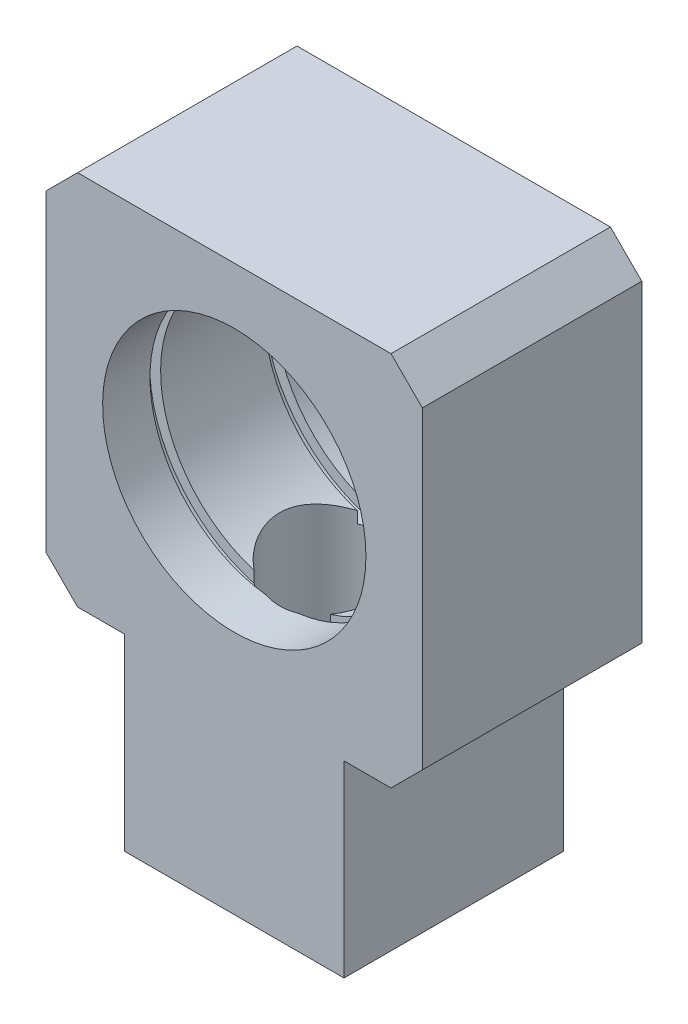
ISO-10303-21;
HEADER;
FILE_DESCRIPTION(('STEP AP214'),'2;1');
FILE_NAME('part.step','',(''),(''),'','','');
FILE_SCHEMA(('AUTOMOTIVE_DESIGN { 1 0 10303 214 1 1 1 1 }'));
ENDSEC;
DATA;
#1=APPLICATION_CONTEXT('core data for automotive mechanical design processes');
#2=APPLICATION_PROTOCOL_DEFINITION('international standard','automotive_design',2000,#1);
#3=PRODUCT_CONTEXT('',#1,'mechanical');
#4=PRODUCT('Part','Part','',(#3));
#5=PRODUCT_RELATED_PRODUCT_CATEGORY('part','',(#4));
#6=PRODUCT_DEFINITION_FORMATION('','',#4);
#7=PRODUCT_DEFINITION_CONTEXT('part definition',#1,'design');
#8=PRODUCT_DEFINITION('design','',#6,#7);
#9=PRODUCT_DEFINITION_SHAPE('','',#8);
#10=(LENGTH_UNIT() NAMED_UNIT(*) SI_UNIT(.MILLI.,.METRE.));
#11=(NAMED_UNIT(*) PLANE_ANGLE_UNIT() SI_UNIT($,.RADIAN.));
#12=(NAMED_UNIT(*) SI_UNIT($,.STERADIAN.) SOLID_ANGLE_UNIT());
#13=UNCERTAINTY_MEASURE_WITH_UNIT(LENGTH_MEASURE(1.E-05),#10,'distance_accuracy_value','');
#14=(GEOMETRIC_REPRESENTATION_CONTEXT(3) GLOBAL_UNCERTAINTY_ASSIGNED_CONTEXT((#13)) GLOBAL_UNIT_ASSIGNED_CONTEXT((#10,
#11,#12)) REPRESENTATION_CONTEXT('',''));
#15=CARTESIAN_POINT('',(0.,0.,0.));
#16=DIRECTION('',(0.,0.,1.));
#17=DIRECTION('',(1.,0.,0.));
#18=AXIS2_PLACEMENT_3D('',#15,#16,#17);
#19=CARTESIAN_POINT('',(0.,0.,17.5));
#20=DIRECTION('',(0.,0.,-1.));
#21=DIRECTION('',(-1.,0.,0.));
#22=AXIS2_PLACEMENT_3D('',#19,#20,#21);
#23=CYLINDRICAL_SURFACE('',#22,21.);
#24=CARTESIAN_POINT('',(0.,-21.,-10.25));
#25=CARTESIAN_POINT('',(-0.270318173228339,-20.9999987988339,-10.2499986530426));
#26=CARTESIAN_POINT('',(-0.540666583604552,-20.9947679895731,-10.2392938241465));
#27=CARTESIAN_POINT('',(-1.07938227490145,-20.9739756386897,-10.1965923011937));
#28=CARTESIAN_POINT('',(-1.34774857407788,-20.958409284867,-10.1645856890712));
#29=CARTESIAN_POINT('',(-1.88085275017994,-20.9173132009866,-10.0795772650897));
#30=CARTESIAN_POINT('',(-2.14558326039659,-20.8917656605435,-10.0265379199633));
#31=CARTESIAN_POINT('',(-2.6690000998639,-20.8313668568692,-9.90007210448331));
#32=CARTESIAN_POINT('',(-2.92768708081298,-20.7965166018708,-9.82664784342236));
#33=CARTESIAN_POINT('',(-3.43636275524586,-20.718527305079,-9.66049845106342));
#34=CARTESIAN_POINT('',(-3.68638105552626,-20.6754206314466,-9.56784857660264));
#35=CARTESIAN_POINT('',(-4.17727974846111,-20.5818555602817,-9.36394581168029));
#36=CARTESIAN_POINT('',(-4.41815992475495,-20.5313969888172,-9.25269248108714));
#37=CARTESIAN_POINT('',(-4.8893957620044,-20.4243035565994,-9.01255887621552));
#38=CARTESIAN_POINT('',(-5.11975556896248,-20.3676711592357,-8.88368562720002));
#39=CARTESIAN_POINT('',(-5.56902932842217,-20.2494419512969,-8.60916655401915));
#40=CARTESIAN_POINT('',(-5.78793872384252,-20.1878431886033,-8.46351412475551));
#41=CARTESIAN_POINT('',(-6.22564478947613,-20.0573301613556,-8.14744745193877));
#42=CARTESIAN_POINT('',(-6.44369230576423,-19.988198778282,-7.97608509697063));
#43=CARTESIAN_POINT('',(-6.86476638395887,-19.8475254815653,-7.61669936588422));
#44=CARTESIAN_POINT('',(-7.0677921326076,-19.7759834377172,-7.42867508892173));
#45=CARTESIAN_POINT('',(-7.45798743307269,-19.632159478354,-7.03686078245045));
#46=CARTESIAN_POINT('',(-7.64514754043553,-19.5598771504602,-6.83306149861386));
#47=CARTESIAN_POINT('',(-8.00258672800502,-19.4163773164506,-6.41074506401727));
#48=CARTESIAN_POINT('',(-8.17286270244347,-19.3451600082794,-6.19222521783807));
#49=CARTESIAN_POINT('',(-8.50740341516571,-19.2005127541019,-5.7249528852893));
#50=CARTESIAN_POINT('',(-8.67031219977446,-19.1273033856383,-5.4751584560692));
#51=CARTESIAN_POINT('',(-8.97428674749512,-18.9865802788274,-4.96122635907348));
#52=CARTESIAN_POINT('',(-9.11536174560266,-18.9190641379568,-4.6970948196436));
#53=CARTESIAN_POINT('',(-9.37444888408,-18.7920337373056,-4.15597825665459));
#54=CARTESIAN_POINT('',(-9.49246766193267,-18.7325171761298,-3.87899696081438));
#55=CARTESIAN_POINT('',(-9.70418846778782,-18.6237191631795,-3.31394356745148));
#56=CARTESIAN_POINT('',(-9.79789305986597,-18.5744366322752,-3.02587264307845));
#57=CARTESIAN_POINT('',(-9.95503040042,-18.4906688265308,-2.45795172283255));
#58=CARTESIAN_POINT('',(-10.0199129674849,-18.455486758189,-2.17860612070889));
#59=CARTESIAN_POINT('',(-10.1261675818067,-18.3974023892141,-1.6142079405387));
#60=CARTESIAN_POINT('',(-10.1675405905251,-18.3744995864026,-1.32915559637226));
#61=CARTESIAN_POINT('',(-10.2261333959265,-18.341955325854,-0.756044965616732));
#62=CARTESIAN_POINT('',(-10.2433719527444,-18.3323035679594,-0.4679891893262));
#63=CARTESIAN_POINT('',(-10.2534788099492,-18.3266531665458,0.108672038019253));
#64=CARTESIAN_POINT('',(-10.246349246455,-18.3306533262945,0.397277438677301));
#65=CARTESIAN_POINT('',(-10.2100238451678,-18.3509062756821,0.939828410630615));
#66=CARTESIAN_POINT('',(-10.1834119413873,-18.3657237692651,1.19400610480151));
#67=CARTESIAN_POINT('',(-10.1114308541839,-18.4054518433169,1.69897780562651));
#68=CARTESIAN_POINT('',(-10.0660554246242,-18.4303657847085,1.94977065677474));
#69=CARTESIAN_POINT('',(-9.95706959593977,-18.4894725737469,2.44618935320285));
#70=CARTESIAN_POINT('',(-9.89346203486704,-18.5236639772004,2.69181599628304));
#71=CARTESIAN_POINT('',(-9.7486302123183,-18.6002934109704,3.17659197933312));
#72=CARTESIAN_POINT('',(-9.66739894048307,-18.642734722234,3.41573869901372));
#73=CARTESIAN_POINT('',(-9.48600984541781,-18.735694041315,3.89158400588454));
#74=CARTESIAN_POINT('',(-9.38546219549037,-18.7863743483669,4.12810199356521));
#75=CARTESIAN_POINT('',(-9.16746864334051,-18.8937100104655,4.59191849422876));
#76=CARTESIAN_POINT('',(-9.0500155966794,-18.9503678889944,4.81921305694754));
#77=CARTESIAN_POINT('',(-8.79901993250228,-19.0682056072212,5.26354106481042));
#78=CARTESIAN_POINT('',(-8.66547527013286,-19.129386021241,5.48057320095973));
#79=CARTESIAN_POINT('',(-8.38306708733057,-19.2548191090897,5.90350355067948));
#80=CARTESIAN_POINT('',(-8.23420239326315,-19.3190720180937,6.1094009093927));
#81=CARTESIAN_POINT('',(-7.90308158589535,-19.4570608190854,6.53334391488445));
#82=CARTESIAN_POINT('',(-7.71896298493929,-19.5310073528778,6.74986943940211));
#83=CARTESIAN_POINT('',(-7.33347801906231,-19.6789916247511,7.16681191156359));
#84=CARTESIAN_POINT('',(-7.1321165594529,-19.7530293310264,7.36723340929788));
#85=CARTESIAN_POINT('',(-6.7129279116282,-19.899394854325,7.75112442603062));
#86=CARTESIAN_POINT('',(-6.4950875879557,-19.971721245659,7.9345801570004));
#87=CARTESIAN_POINT('',(-6.04424444874528,-20.1127539546592,8.28316173534707));
#88=CARTESIAN_POINT('',(-5.81124769162774,-20.1814616991588,8.44829483620128));
#89=CARTESIAN_POINT('',(-5.3209399128357,-20.3163717049433,8.76578507095922));
#90=CARTESIAN_POINT('',(-5.06301558302457,-20.3823418789473,8.91729613447416));
#91=CARTESIAN_POINT('',(-4.5334270187572,-20.5066332780543,9.197843649426));
#92=CARTESIAN_POINT('',(-4.26176219444534,-20.5649541744004,9.32687913496687));
#93=CARTESIAN_POINT('',(-3.70671086277333,-20.6722067042029,9.56103862263682));
#94=CARTESIAN_POINT('',(-3.42333161008945,-20.7211440460084,9.66617716938462));
#95=CARTESIAN_POINT('',(-2.84687683218626,-20.8081767538694,9.85136586493223));
#96=CARTESIAN_POINT('',(-2.55380236698238,-20.8462733008467,9.93141874648867));
#97=CARTESIAN_POINT('',(-1.98424546455451,-20.907848533558,10.0599972648842));
#98=CARTESIAN_POINT('',(-1.70831653664,-20.9322542879429,10.110535944578));
#99=CARTESIAN_POINT('',(-1.15250839662832,-20.9702000638442,10.1888650491184));
#100=CARTESIAN_POINT('',(-0.872629393876015,-20.9837406590051,10.2166566749354));
#101=CARTESIAN_POINT('',(-0.311321597996491,-20.9995686444346,10.2491259892888));
#102=CARTESIAN_POINT('',(-0.0298934228976507,-21.0018602367679,10.2538123088146));
#103=CARTESIAN_POINT('',(0.532253660535255,-20.9951353009203,10.2400315032274));
#104=CARTESIAN_POINT('',(0.812972596995475,-20.9861192284491,10.2215653111829));
#105=CARTESIAN_POINT('',(1.35091450503795,-20.9581057199465,10.1639200191812));
#106=CARTESIAN_POINT('',(1.60835334877453,-20.9398871484817,10.1263558814498));
#107=CARTESIAN_POINT('',(2.11884405765455,-20.894404999159,10.0319674489777));
#108=CARTESIAN_POINT('',(2.37189618799868,-20.8671419701084,9.97514432284598));
#109=CARTESIAN_POINT('',(2.87200249052397,-20.8042094199224,9.84281537679981));
#110=CARTESIAN_POINT('',(3.11905631502212,-20.7685394127657,9.76730847673325));
#111=CARTESIAN_POINT('',(3.60568626478214,-20.6896061950264,9.59832699531944));
#112=CARTESIAN_POINT('',(3.84526207986686,-20.6463426699672,9.50485166981573));
#113=CARTESIAN_POINT('',(4.32252893617163,-20.5518033800336,9.29773446729839));
#114=CARTESIAN_POINT('',(4.55995964861232,-20.5003301935435,9.18358248280112));
#115=CARTESIAN_POINT('',(5.02433669232903,-20.3914937290514,8.93798653568348));
#116=CARTESIAN_POINT('',(5.25127922862138,-20.3341283428711,8.80653637916265));
#117=CARTESIAN_POINT('',(5.91467243691442,-20.1550491312242,8.38763934873182));
#118=CARTESIAN_POINT('',(6.3339409496093,-20.026300260246,8.07553560441584));
#119=CARTESIAN_POINT('',(7.15611893747638,-19.7483129281856,7.36048433870667));
#120=CARTESIAN_POINT('',(7.55373127453492,-19.5982882439724,6.95173690260287));
#121=CARTESIAN_POINT('',(8.09583568190091,-19.37771252516,6.29293847459606));
#122=CARTESIAN_POINT('',(8.26758441558532,-19.3048821771761,6.06555359871215));
#123=CARTESIAN_POINT('',(8.59206982079817,-19.1626633517356,5.5964384701259));
#124=CARTESIAN_POINT('',(8.74480387331829,-19.0932753492042,5.35470624803221));
#125=CARTESIAN_POINT('',(9.03620087014209,-18.9571637836342,4.84754945026265));
#126=CARTESIAN_POINT('',(9.17398366134594,-18.8906807722177,4.58155386503065));
#127=CARTESIAN_POINT('',(9.42629526302332,-18.7660533393148,4.03700889085535));
#128=CARTESIAN_POINT('',(9.54083521659381,-18.7079049259951,3.75846559618715));
#129=CARTESIAN_POINT('',(9.74537454259371,-18.6021756568868,3.19078711099365));
#130=CARTESIAN_POINT('',(9.83539250434165,-18.5545868013474,2.90166013329122));
#131=CARTESIAN_POINT('',(9.98978230313682,-18.4719232133631,2.31489465549466));
#132=CARTESIAN_POINT('',(10.0541578786915,-18.4368466567774,2.01725740293464));
#133=CARTESIAN_POINT('',(10.1514618871516,-18.3834325712262,1.44449831214157));
#134=CARTESIAN_POINT('',(10.1867830283427,-18.3638286262045,1.16989948761341));
#135=CARTESIAN_POINT('',(10.2350899872009,-18.3369493294142,0.618144846168459));
#136=CARTESIAN_POINT('',(10.2480772859701,-18.3296731601111,0.340989200036739));
#137=CARTESIAN_POINT('',(10.2515257536226,-18.3277445779209,-0.213414819139203));
#138=CARTESIAN_POINT('',(10.2419940626178,-18.333088163679,-0.490663134930343));
#139=CARTESIAN_POINT('',(10.2005601585316,-18.3561742566411,-1.04295250004464));
#140=CARTESIAN_POINT('',(10.1686587079231,-18.3739163412425,-1.31799362427673));
#141=CARTESIAN_POINT('',(10.0866848475858,-18.4190324486075,-1.83979557839031));
#142=CARTESIAN_POINT('',(10.038439133718,-18.4454318649835,-2.08693140076284));
#143=CARTESIAN_POINT('',(9.92420012020542,-18.5071463134535,-2.57601123494313));
#144=CARTESIAN_POINT('',(9.85820090607491,-18.5424643164874,-2.81795348748304));
#145=CARTESIAN_POINT('',(9.70911965399034,-18.6209581057239,-3.29514442603323));
#146=CARTESIAN_POINT('',(9.62604055396127,-18.6641325403889,-3.53039425530085));
#147=CARTESIAN_POINT('',(9.44346148158935,-18.7571727831222,-3.99317485351442));
#148=CARTESIAN_POINT('',(9.34395413299415,-18.8070415950648,-4.22070209945804));
#149=CARTESIAN_POINT('',(9.12207921122348,-18.9157058630856,-4.68187546079921));
#150=CARTESIAN_POINT('',(8.99862727517764,-18.9748754056176,-4.9149116620129));
#151=CARTESIAN_POINT('',(8.73474486152369,-19.0977855555511,-5.36990786305623));
#152=CARTESIAN_POINT('',(8.59431293853452,-19.1615265518985,-5.59186691769497));
#153=CARTESIAN_POINT('',(8.2972564149288,-19.2920153496824,-6.02385022704975));
#154=CARTESIAN_POINT('',(8.14062626896335,-19.3587641763864,-6.23387035617231));
#155=CARTESIAN_POINT('',(7.81199351578102,-19.4936993491777,-6.64106350798705));
#156=CARTESIAN_POINT('',(7.63998873784177,-19.5618858972129,-6.83823470974093));
#157=CARTESIAN_POINT('',(7.26094392399879,-19.7059467478601,-7.24058244097482));
#158=CARTESIAN_POINT('',(7.05214516547476,-19.7818114474821,-7.44410982439242));
#159=CARTESIAN_POINT('',(6.61760830809668,-19.9313833368451,-7.83292653668488));
#160=CARTESIAN_POINT('',(6.3918751611857,-20.0050911486058,-8.01822116081735));
#161=CARTESIAN_POINT('',(5.92439521003007,-20.148482592239,-8.36956344171651));
#162=CARTESIAN_POINT('',(5.68263643494747,-20.2181631414127,-8.53559644993758));
#163=CARTESIAN_POINT('',(5.18458638196487,-20.351572724739,-8.84696573890237));
#164=CARTESIAN_POINT('',(4.92829601728285,-20.4153021322182,-8.99230331821103));
#165=CARTESIAN_POINT('',(4.40208152091667,-20.5352052557324,-9.26130058426525));
#166=CARTESIAN_POINT('',(4.1321270006622,-20.5913610126499,-9.38490894865318));
#167=CARTESIAN_POINT('',(3.58097920366841,-20.6943264915082,-9.60872137011791));
#168=CARTESIAN_POINT('',(3.29978728176606,-20.7411373360626,-9.70892823868537));
#169=CARTESIAN_POINT('',(2.72896575894153,-20.8239217552176,-9.88454356413071));
#170=CARTESIAN_POINT('',(2.43935840016673,-20.8599214725486,-9.96001188324078));
#171=CARTESIAN_POINT('',(1.85361221412255,-20.9201025032062,-10.0854465398795));
#172=CARTESIAN_POINT('',(1.55747762241015,-20.9442912577174,-10.135428935021));
#173=CARTESIAN_POINT('',(1.05079602461788,-20.9747364510694,-10.1981640368828));
#174=CARTESIAN_POINT('',(0.841239599202228,-20.9841961431589,-10.2175883917754));
#175=CARTESIAN_POINT('',(0.421128249385532,-20.9968284681552,-10.2435070680174));
#176=CARTESIAN_POINT('',(0.210573298866122,-21.0000009356881,-10.2500010492571));
#177=CARTESIAN_POINT('',(0.,-21.,-10.25));
#178=B_SPLINE_CURVE_WITH_KNOTS('',3,(#24,#25,#26,#27,#28,#29,#30,#31,#32,#33,#34,#35,#36,#37,
#38,#39,#40,#41,#42,#43,#44,#45,#46,#47,#48,#49,#50,#51,#52,#53,#54,#55,#56,#57,#58,#59,#60,#61,
#62,#63,#64,#65,#66,#67,#68,#69,#70,#71,#72,#73,#74,#75,#76,#77,#78,#79,#80,#81,#82,#83,#84,#85,
#86,#87,#88,#89,#90,#91,#92,#93,#94,#95,#96,#97,#98,#99,#100,#101,#102,#103,#104,#105,#106,#107,
#108,#109,#110,#111,#112,#113,#114,#115,#116,#117,#118,#119,#120,#121,#122,#123,#124,#125,#126,
#127,#128,#129,#130,#131,#132,#133,#134,#135,#136,#137,#138,#139,#140,#141,#142,#143,#144,#145,
#146,#147,#148,#149,#150,#151,#152,#153,#154,#155,#156,#157,#158,#159,#160,#161,#162,#163,#164,
#165,#166,#167,#168,#169,#170,#171,#172,#173,#174,#175,#176,#177),.UNSPECIFIED.,.T.,.F.,(4,2,2,
2,2,2,2,2,2,2,2,2,2,2,2,2,2,2,2,2,2,2,2,2,2,2,2,2,2,2,2,2,2,2,2,2,2,2,2,2,2,2,2,2,2,2,2,2,2,2,2,
2,2,2,2,2,2,2,2,2,2,2,2,2,2,2,2,2,2,2,2,2,2,2,2,2,4),(0.,0.810746223096419,1.62187019226952,
2.43444818704521,3.24693814995037,4.05630574600379,4.86569249326507,5.67475746478747,
6.48414201884374,7.34066735903692,8.1972390364537,9.05431708226965,9.91155249280564,
10.8316358778525,11.7513290270864,12.6707570213139,13.5900880169423,14.455657369764,
15.3211913211786,16.1860521035418,17.0508370738159,17.817922978328,18.585264441713,
19.3524865239187,20.1200143530839,20.905068473692,21.690455347788,22.4759421309369,
23.2614891333901,24.1415751671793,25.0214116574028,25.9019570173859,26.7821525380261,
27.699914429064,28.6177157515227,29.5349569590863,30.4520982103977,31.2957111759795,
32.1392795986663,32.9825328824007,33.8257521833123,34.6072539142987,35.3887082333165,
36.1702077405703,36.9517396203467,37.7561424659288,38.5608341291658,40.1693860703553,
41.9300645248261,42.8116198927977,43.6932965487611,44.6126480521942,45.5315577527345,
46.4497689071015,47.367846142701,48.1993628703729,49.030824452641,49.8620224381795,
50.6931920937197,51.4518972485665,52.210855475775,52.9696832630303,53.7288526937797,
54.5388399905409,55.3488962841516,56.1592308187133,56.9696799445174,57.8725052770749,
58.7750676274359,59.6783119421945,60.5814995565708,61.4867925614521,62.3919767470613,
63.2949541190027,64.197361857549,64.8289028833052,65.4604605203733),.UNSPECIFIED.);
#179=CARTESIAN_POINT('',(-6.08276253029821,-20.0997512422418,-8.25000000000002));
#180=VERTEX_POINT('',#179);
#181=CARTESIAN_POINT('',(-6.08276253029819,-20.0997512422418,8.25));
#182=VERTEX_POINT('',#181);
#183=EDGE_CURVE('E201',#180,#182,#178,.T.);
#184=ORIENTED_EDGE('',*,*,#183,.F.);
#185=CARTESIAN_POINT('',(0.,0.,-8.25));
#186=DIRECTION('',(0.,0.,1.));
#187=DIRECTION('',(1.,0.,0.));
#188=AXIS2_PLACEMENT_3D('',#185,#186,#187);
#189=CIRCLE('',#188,21.);
#190=CARTESIAN_POINT('',(6.08276253029822,-20.0997512422418,-8.25));
#191=VERTEX_POINT('',#190);
#192=EDGE_CURVE('E194',#191,#180,#189,.T.);
#193=ORIENTED_EDGE('',*,*,#192,.F.);
#194=CARTESIAN_POINT('',(6.08276253029822,-20.0997512422418,8.25));
#195=VERTEX_POINT('',#194);
#196=EDGE_CURVE('E200',#195,#191,#178,.T.);
#197=ORIENTED_EDGE('',*,*,#196,.F.);
#198=CARTESIAN_POINT('',(0.,0.,8.25));
#199=DIRECTION('',(0.,0.,1.));
#200=DIRECTION('',(1.,0.,0.));
#201=AXIS2_PLACEMENT_3D('',#198,#199,#200);
#202=CIRCLE('',#201,21.);
#203=EDGE_CURVE('E463',#195,#182,#202,.T.);
#204=ORIENTED_EDGE('',*,*,#203,.T.);
#205=EDGE_LOOP('',(#184,#193,#197,#204));
#206=FACE_BOUND('',#205,.T.);
#207=ADVANCED_FACE('F38',(#206),#23,.F.);
#208=CARTESIAN_POINT('',(0.,0.,-9.95));
#209=DIRECTION('',(0.,0.,1.));
#210=DIRECTION('',(1.,0.,0.));
#211=AXIS2_PLACEMENT_3D('',#208,#209,#210);
#212=CIRCLE('',#211,21.);
#213=CARTESIAN_POINT('',(2.46170672501821,-20.8552151751067,-9.95));
#214=VERTEX_POINT('',#213);
#215=CARTESIAN_POINT('',(-2.46170672501819,-20.8552151751067,-9.95));
#216=VERTEX_POINT('',#215);
#217=EDGE_CURVE('E178',#214,#216,#212,.T.);
#218=ORIENTED_EDGE('',*,*,#217,.T.);
#219=EDGE_CURVE('E192',#214,#216,#178,.T.);
#220=ORIENTED_EDGE('',*,*,#219,.F.);
#221=EDGE_LOOP('',(#218,#220));
#222=FACE_BOUND('',#221,.T.);
#223=CARTESIAN_POINT('',(0.,0.,-17.5));
#224=DIRECTION('',(0.,0.,1.));
#225=DIRECTION('',(1.,0.,0.));
#226=AXIS2_PLACEMENT_3D('',#223,#224,#225);
#227=CIRCLE('',#226,21.);
#228=CARTESIAN_POINT('',(21.,0.,-17.5));
#229=VERTEX_POINT('',#228);
#230=EDGE_CURVE('E247',#229,#229,#227,.T.);
#231=ORIENTED_EDGE('',*,*,#230,.F.);
#232=EDGE_LOOP('',(#231));
#233=FACE_BOUND('',#232,.T.);
#234=ADVANCED_FACE('F190',(#222,#233),#23,.F.);
#235=CARTESIAN_POINT('',(17.5,-99.2752433305183,17.5));
#236=DIRECTION('',(1.,0.,0.));
#237=DIRECTION('',(0.,1.,0.));
#238=AXIS2_PLACEMENT_3D('',#235,#236,#237);
#239=PLANE('',#238);
#240=DIRECTION('',(0.,-1.,0.));
#241=VECTOR('',#240,1.);
#242=CARTESIAN_POINT('',(17.5,-99.2752433305183,-17.5));
#243=LINE('',#242,#241);
#244=CARTESIAN_POINT('',(17.5,-30.,-17.5));
#245=VERTEX_POINT('',#244);
#246=CARTESIAN_POINT('',(17.5,-60.,-17.5));
#247=VERTEX_POINT('',#246);
#248=EDGE_CURVE('E214',#245,#247,#243,.T.);
#249=ORIENTED_EDGE('',*,*,#248,.F.);
#250=DIRECTION('',(0.,0.,-1.));
#251=VECTOR('',#250,1.);
#252=CARTESIAN_POINT('',(17.5,-30.,17.5));
#253=LINE('',#252,#251);
#254=CARTESIAN_POINT('',(17.5,-30.,17.5));
#255=VERTEX_POINT('',#254);
#256=EDGE_CURVE('E258',#255,#245,#253,.T.);
#257=ORIENTED_EDGE('',*,*,#256,.F.);
#258=DIRECTION('',(0.,-1.,0.));
#259=VECTOR('',#258,1.);
#260=CARTESIAN_POINT('',(17.5,-99.2752433305183,17.5));
#261=LINE('',#260,#259);
#262=CARTESIAN_POINT('',(17.5,-60.,17.5));
#263=VERTEX_POINT('',#262);
#264=EDGE_CURVE('E250',#255,#263,#261,.T.);
#265=ORIENTED_EDGE('',*,*,#264,.T.);
#266=DIRECTION('',(0.,0.,-1.));
#267=VECTOR('',#266,1.);
#268=CARTESIAN_POINT('',(17.5,-60.,17.5));
#269=LINE('',#268,#267);
#270=EDGE_CURVE('E251',#263,#247,#269,.T.);
#271=ORIENTED_EDGE('',*,*,#270,.T.);
#272=EDGE_LOOP('',(#249,#257,#265,#271));
#273=FACE_BOUND('',#272,.T.);
#274=ADVANCED_FACE('F403',(#273),#239,.T.);
#275=CARTESIAN_POINT('',(0.,-30.,17.5));
#276=DIRECTION('',(0.,1.,0.));
#277=DIRECTION('',(0.,0.,1.));
#278=AXIS2_PLACEMENT_3D('',#275,#276,#277);
#279=PLANE('',#278);
#280=DIRECTION('',(1.,0.,0.));
#281=VECTOR('',#280,1.);
#282=CARTESIAN_POINT('',(0.,-30.,-17.5));
#283=LINE('',#282,#281);
#284=CARTESIAN_POINT('',(25.,-30.,-17.5));
#285=VERTEX_POINT('',#284);
#286=EDGE_CURVE('E219',#245,#285,#283,.T.);
#287=ORIENTED_EDGE('',*,*,#286,.T.);
#288=DIRECTION('',(0.,0.,1.));
#289=VECTOR('',#288,1.);
#290=CARTESIAN_POINT('',(25.,-30.,17.5));
#291=LINE('',#290,#289);
#292=CARTESIAN_POINT('',(25.,-30.,17.5));
#293=VERTEX_POINT('',#292);
#294=EDGE_CURVE('E335',#285,#293,#291,.T.);
#295=ORIENTED_EDGE('',*,*,#294,.T.);
#296=DIRECTION('',(1.,0.,0.));
#297=VECTOR('',#296,1.);
#298=CARTESIAN_POINT('',(0.,-30.,17.5));
#299=LINE('',#298,#297);
#300=EDGE_CURVE('E450',#255,#293,#299,.T.);
#301=ORIENTED_EDGE('',*,*,#300,.F.);
#302=ORIENTED_EDGE('',*,*,#256,.T.);
#303=EDGE_LOOP('',(#287,#295,#301,#302));
#304=FACE_BOUND('',#303,.T.);
#305=ADVANCED_FACE('F425',(#304),#279,.F.);
#306=CARTESIAN_POINT('',(30.,-99.2752433305183,17.5));
#307=DIRECTION('',(-1.,0.,0.));
#308=DIRECTION('',(0.,0.,1.));
#309=AXIS2_PLACEMENT_3D('',#306,#307,#308);
#310=PLANE('',#309);
#311=DIRECTION('',(0.,1.,0.));
#312=VECTOR('',#311,1.);
#313=CARTESIAN_POINT('',(30.,-99.2752433305183,17.5));
#314=LINE('',#313,#312);
#315=CARTESIAN_POINT('',(30.,-25.,17.5));
#316=VERTEX_POINT('',#315);
#317=CARTESIAN_POINT('',(30.,25.,17.5));
#318=VERTEX_POINT('',#317);
#319=EDGE_CURVE('E375',#316,#318,#314,.T.);
#320=ORIENTED_EDGE('',*,*,#319,.F.);
#321=DIRECTION('',(0.,0.,-1.));
#322=VECTOR('',#321,1.);
#323=CARTESIAN_POINT('',(30.,-25.,17.5));
#324=LINE('',#323,#322);
#325=CARTESIAN_POINT('',(30.,-25.,-17.5));
#326=VERTEX_POINT('',#325);
#327=EDGE_CURVE('E324',#316,#326,#324,.T.);
#328=ORIENTED_EDGE('',*,*,#327,.T.);
#329=DIRECTION('',(0.,1.,0.));
#330=VECTOR('',#329,1.);
#331=CARTESIAN_POINT('',(30.,-99.2752433305183,-17.5));
#332=LINE('',#331,#330);
#333=CARTESIAN_POINT('',(30.,25.,-17.5));
#334=VERTEX_POINT('',#333);
#335=EDGE_CURVE('E226',#326,#334,#332,.T.);
#336=ORIENTED_EDGE('',*,*,#335,.T.);
#337=DIRECTION('',(0.,0.,1.));
#338=VECTOR('',#337,1.);
#339=CARTESIAN_POINT('',(30.,25.,17.5));
#340=LINE('',#339,#338);
#341=EDGE_CURVE('E322',#334,#318,#340,.T.);
#342=ORIENTED_EDGE('',*,*,#341,.T.);
#343=EDGE_LOOP('',(#320,#328,#336,#342));
#344=FACE_BOUND('',#343,.T.);
#345=ADVANCED_FACE('F422',(#344),#310,.F.);
#346=CARTESIAN_POINT('',(0.,30.,17.5));
#347=DIRECTION('',(0.,1.,0.));
#348=DIRECTION('',(0.,0.,1.));
#349=AXIS2_PLACEMENT_3D('',#346,#347,#348);
#350=PLANE('',#349);
#351=DIRECTION('',(1.,0.,0.));
#352=VECTOR('',#351,1.);
#353=CARTESIAN_POINT('',(0.,30.,-17.5));
#354=LINE('',#353,#352);
#355=CARTESIAN_POINT('',(-25.,30.,-17.5));
#356=VERTEX_POINT('',#355);
#357=CARTESIAN_POINT('',(25.,30.,-17.5));
#358=VERTEX_POINT('',#357);
#359=EDGE_CURVE('E234',#356,#358,#354,.T.);
#360=ORIENTED_EDGE('',*,*,#359,.F.);
#361=DIRECTION('',(0.,0.,1.));
#362=VECTOR('',#361,1.);
#363=CARTESIAN_POINT('',(-25.,30.,17.5));
#364=LINE('',#363,#362);
#365=CARTESIAN_POINT('',(-24.9999999999999,30.,17.5));
#366=VERTEX_POINT('',#365);
#367=EDGE_CURVE('E11',#356,#366,#364,.T.);
#368=ORIENTED_EDGE('',*,*,#367,.T.);
#369=DIRECTION('',(1.,0.,0.));
#370=VECTOR('',#369,1.);
#371=CARTESIAN_POINT('',(0.,30.,17.5));
#372=LINE('',#371,#370);
#373=CARTESIAN_POINT('',(24.9999999999999,30.,17.5));
#374=VERTEX_POINT('',#373);
#375=EDGE_CURVE('E357',#366,#374,#372,.T.);
#376=ORIENTED_EDGE('',*,*,#375,.T.);
#377=DIRECTION('',(0.,0.,-1.));
#378=VECTOR('',#377,1.);
#379=CARTESIAN_POINT('',(25.,30.,-17.5));
#380=LINE('',#379,#378);
#381=EDGE_CURVE('E46',#374,#358,#380,.T.);
#382=ORIENTED_EDGE('',*,*,#381,.T.);
#383=EDGE_LOOP('',(#360,#368,#376,#382));
#384=FACE_BOUND('',#383,.T.);
#385=ADVANCED_FACE('F355',(#384),#350,.T.);
#386=CARTESIAN_POINT('',(-30.,-99.2752433305183,17.5));
#387=DIRECTION('',(-1.,0.,0.));
#388=DIRECTION('',(0.,0.,1.));
#389=AXIS2_PLACEMENT_3D('',#386,#387,#388);
#390=PLANE('',#389);
#391=DIRECTION('',(0.,1.,0.));
#392=VECTOR('',#391,1.);
#393=CARTESIAN_POINT('',(-30.,-99.2752433305183,-17.5));
#394=LINE('',#393,#392);
#395=CARTESIAN_POINT('',(-30.,-25.,-17.5));
#396=VERTEX_POINT('',#395);
#397=CARTESIAN_POINT('',(-30.,24.9999999999999,-17.5));
#398=VERTEX_POINT('',#397);
#399=EDGE_CURVE('E237',#396,#398,#394,.T.);
#400=ORIENTED_EDGE('',*,*,#399,.F.);
#401=DIRECTION('',(0.,0.,1.));
#402=VECTOR('',#401,1.);
#403=CARTESIAN_POINT('',(-30.,-25.,17.5));
#404=LINE('',#403,#402);
#405=CARTESIAN_POINT('',(-30.,-25.,17.5));
#406=VERTEX_POINT('',#405);
#407=EDGE_CURVE('E349',#396,#406,#404,.T.);
#408=ORIENTED_EDGE('',*,*,#407,.T.);
#409=DIRECTION('',(0.,1.,0.));
#410=VECTOR('',#409,1.);
#411=CARTESIAN_POINT('',(-30.,-99.2752433305183,17.5));
#412=LINE('',#411,#410);
#413=CARTESIAN_POINT('',(-30.,24.9999999999999,17.5));
#414=VERTEX_POINT('',#413);
#415=EDGE_CURVE('E370',#406,#414,#412,.T.);
#416=ORIENTED_EDGE('',*,*,#415,.T.);
#417=DIRECTION('',(0.,0.,-1.));
#418=VECTOR('',#417,1.);
#419=CARTESIAN_POINT('',(-30.,25.,17.5));
#420=LINE('',#419,#418);
#421=EDGE_CURVE('E346',#414,#398,#420,.T.);
#422=ORIENTED_EDGE('',*,*,#421,.T.);
#423=EDGE_LOOP('',(#400,#408,#416,#422));
#424=FACE_BOUND('',#423,.T.);
#425=ADVANCED_FACE('F368',(#424),#390,.T.);
#426=CARTESIAN_POINT('',(0.,-30.,17.5));
#427=DIRECTION('',(0.,1.,0.));
#428=DIRECTION('',(0.,0.,1.));
#429=AXIS2_PLACEMENT_3D('',#426,#427,#428);
#430=PLANE('',#429);
#431=DIRECTION('',(1.,0.,0.));
#432=VECTOR('',#431,1.);
#433=CARTESIAN_POINT('',(0.,-30.,17.5));
#434=LINE('',#433,#432);
#435=CARTESIAN_POINT('',(-25.,-30.,17.5));
#436=VERTEX_POINT('',#435);
#437=CARTESIAN_POINT('',(-17.5,-30.,17.5));
#438=VERTEX_POINT('',#437);
#439=EDGE_CURVE('E371',#436,#438,#434,.T.);
#440=ORIENTED_EDGE('',*,*,#439,.F.);
#441=DIRECTION('',(0.,0.,-1.));
#442=VECTOR('',#441,1.);
#443=CARTESIAN_POINT('',(-25.,-30.,-17.5));
#444=LINE('',#443,#442);
#445=CARTESIAN_POINT('',(-25.,-30.,-17.5));
#446=VERTEX_POINT('',#445);
#447=EDGE_CURVE('E343',#436,#446,#444,.T.);
#448=ORIENTED_EDGE('',*,*,#447,.T.);
#449=DIRECTION('',(1.,0.,0.));
#450=VECTOR('',#449,1.);
#451=CARTESIAN_POINT('',(0.,-30.,-17.5));
#452=LINE('',#451,#450);
#453=CARTESIAN_POINT('',(-17.5,-30.,-17.5));
#454=VERTEX_POINT('',#453);
#455=EDGE_CURVE('E240',#446,#454,#452,.T.);
#456=ORIENTED_EDGE('',*,*,#455,.T.);
#457=DIRECTION('',(0.,0.,-1.));
#458=VECTOR('',#457,1.);
#459=CARTESIAN_POINT('',(-17.5,-30.,17.5));
#460=LINE('',#459,#458);
#461=EDGE_CURVE('E256',#438,#454,#460,.T.);
#462=ORIENTED_EDGE('',*,*,#461,.F.);
#463=EDGE_LOOP('',(#440,#448,#456,#462));
#464=FACE_BOUND('',#463,.T.);
#465=ADVANCED_FACE('F413',(#464),#430,.F.);
#466=CARTESIAN_POINT('',(-17.5,-99.2752433305183,17.5));
#467=DIRECTION('',(1.,0.,0.));
#468=DIRECTION('',(0.,0.,-1.));
#469=AXIS2_PLACEMENT_3D('',#466,#467,#468);
#470=PLANE('',#469);
#471=DIRECTION('',(0.,-1.,0.));
#472=VECTOR('',#471,1.);
#473=CARTESIAN_POINT('',(-17.5,-99.2752433305183,-17.5));
#474=LINE('',#473,#472);
#475=CARTESIAN_POINT('',(-17.5,-60.,-17.5));
#476=VERTEX_POINT('',#475);
#477=EDGE_CURVE('E242',#454,#476,#474,.T.);
#478=ORIENTED_EDGE('',*,*,#477,.T.);
#479=DIRECTION('',(0.,0.,-1.));
#480=VECTOR('',#479,1.);
#481=CARTESIAN_POINT('',(-17.5,-60.,17.5));
#482=LINE('',#481,#480);
#483=CARTESIAN_POINT('',(-17.5,-60.,17.5));
#484=VERTEX_POINT('',#483);
#485=EDGE_CURVE('E253',#484,#476,#482,.T.);
#486=ORIENTED_EDGE('',*,*,#485,.F.);
#487=DIRECTION('',(0.,-1.,0.));
#488=VECTOR('',#487,1.);
#489=CARTESIAN_POINT('',(-17.5,-99.2752433305183,17.5));
#490=LINE('',#489,#488);
#491=EDGE_CURVE('E373',#438,#484,#490,.T.);
#492=ORIENTED_EDGE('',*,*,#491,.F.);
#493=ORIENTED_EDGE('',*,*,#461,.T.);
#494=EDGE_LOOP('',(#478,#486,#492,#493));
#495=FACE_BOUND('',#494,.T.);
#496=ADVANCED_FACE('F409',(#495),#470,.F.);
#497=CARTESIAN_POINT('',(0.,-60.,17.5));
#498=DIRECTION('',(0.,1.,0.));
#499=DIRECTION('',(-1.,0.,0.));
#500=AXIS2_PLACEMENT_3D('',#497,#498,#499);
#501=PLANE('',#500);
#502=CARTESIAN_POINT('',(0.,-60.,0.));
#503=DIRECTION('',(0.,-1.,0.));
#504=DIRECTION('',(0.,0.,-1.));
#505=AXIS2_PLACEMENT_3D('',#502,#503,#504);
#506=CIRCLE('',#505,10.25);
#507=CARTESIAN_POINT('',(0.,-60.,-10.25));
#508=VERTEX_POINT('',#507);
#509=EDGE_CURVE('E205',#508,#508,#506,.T.);
#510=ORIENTED_EDGE('',*,*,#509,.F.);
#511=EDGE_LOOP('',(#510));
#512=FACE_BOUND('',#511,.T.);
#513=DIRECTION('',(1.,0.,0.));
#514=VECTOR('',#513,1.);
#515=CARTESIAN_POINT('',(0.,-60.,-17.5));
#516=LINE('',#515,#514);
#517=EDGE_CURVE('E244',#476,#247,#516,.T.);
#518=ORIENTED_EDGE('',*,*,#517,.T.);
#519=ORIENTED_EDGE('',*,*,#270,.F.);
#520=DIRECTION('',(1.,0.,0.));
#521=VECTOR('',#520,1.);
#522=CARTESIAN_POINT('',(0.,-60.,17.5));
#523=LINE('',#522,#521);
#524=EDGE_CURVE('E379',#484,#263,#523,.T.);
#525=ORIENTED_EDGE('',*,*,#524,.F.);
#526=ORIENTED_EDGE('',*,*,#485,.T.);
#527=EDGE_LOOP('',(#518,#519,#525,#526));
#528=FACE_BOUND('',#527,.T.);
#529=ADVANCED_FACE('F395',(#512,#528),#501,.F.);
#530=CARTESIAN_POINT('',(0.,0.,9.95));
#531=DIRECTION('',(0.,0.,1.));
#532=DIRECTION('',(1.,0.,0.));
#533=AXIS2_PLACEMENT_3D('',#530,#531,#532);
#534=CIRCLE('',#533,21.);
#535=CARTESIAN_POINT('',(2.46170672501821,-20.8552151751067,9.95));
#536=VERTEX_POINT('',#535);
#537=CARTESIAN_POINT('',(-2.46170672501819,-20.8552151751067,9.95));
#538=VERTEX_POINT('',#537);
#539=EDGE_CURVE('E461',#536,#538,#534,.T.);
#540=ORIENTED_EDGE('',*,*,#539,.F.);
#541=EDGE_CURVE('E203',#538,#536,#178,.T.);
#542=ORIENTED_EDGE('',*,*,#541,.F.);
#543=EDGE_LOOP('',(#540,#542));
#544=FACE_BOUND('',#543,.T.);
#545=CARTESIAN_POINT('',(0.,0.,17.5));
#546=DIRECTION('',(0.,0.,1.));
#547=DIRECTION('',(1.,0.,0.));
#548=AXIS2_PLACEMENT_3D('',#545,#546,#547);
#549=CIRCLE('',#548,21.);
#550=CARTESIAN_POINT('',(21.,0.,17.5));
#551=VERTEX_POINT('',#550);
#552=EDGE_CURVE('E229',#551,#551,#549,.T.);
#553=ORIENTED_EDGE('',*,*,#552,.T.);
#554=EDGE_LOOP('',(#553));
#555=FACE_BOUND('',#554,.T.);
#556=ADVANCED_FACE('F386',(#544,#555),#23,.F.);
#557=CARTESIAN_POINT('',(0.,-99.2752433305183,17.5));
#558=DIRECTION('',(0.,0.,1.));
#559=DIRECTION('',(1.,0.,0.));
#560=AXIS2_PLACEMENT_3D('',#557,#558,#559);
#561=PLANE('',#560);
#562=ORIENTED_EDGE('',*,*,#300,.T.);
#563=DIRECTION('',(-0.707106781186548,-0.707106781186548,0.));
#564=VECTOR('',#563,1.);
#565=CARTESIAN_POINT('',(-22.1376216652591,-77.1376216652591,17.5));
#566=LINE('',#565,#564);
#567=EDGE_CURVE('E341',#293,#316,#566,.F.);
#568=ORIENTED_EDGE('',*,*,#567,.T.);
#569=ORIENTED_EDGE('',*,*,#319,.T.);
#570=DIRECTION('',(-0.707106781186548,0.707106781186548,0.));
#571=VECTOR('',#570,1.);
#572=CARTESIAN_POINT('',(77.1376216652591,-22.1376216652591,17.5));
#573=LINE('',#572,#571);
#574=EDGE_CURVE('E337',#318,#374,#573,.T.);
#575=ORIENTED_EDGE('',*,*,#574,.T.);
#576=ORIENTED_EDGE('',*,*,#375,.F.);
#577=DIRECTION('',(0.707106781186548,0.707106781186548,0.));
#578=VECTOR('',#577,1.);
#579=CARTESIAN_POINT('',(-77.1376216652591,-22.1376216652592,17.5));
#580=LINE('',#579,#578);
#581=EDGE_CURVE('E59',#366,#414,#580,.F.);
#582=ORIENTED_EDGE('',*,*,#581,.T.);
#583=ORIENTED_EDGE('',*,*,#415,.F.);
#584=DIRECTION('',(0.707106781186548,-0.707106781186548,0.));
#585=VECTOR('',#584,1.);
#586=CARTESIAN_POINT('',(22.1376216652591,-77.1376216652591,17.5));
#587=LINE('',#586,#585);
#588=EDGE_CURVE('E53',#406,#436,#587,.T.);
#589=ORIENTED_EDGE('',*,*,#588,.T.);
#590=ORIENTED_EDGE('',*,*,#439,.T.);
#591=ORIENTED_EDGE('',*,*,#491,.T.);
#592=ORIENTED_EDGE('',*,*,#524,.T.);
#593=ORIENTED_EDGE('',*,*,#264,.F.);
#594=EDGE_LOOP('',(#562,#568,#569,#575,#576,#582,#583,#589,#590,#591,#592,#593));
#595=FACE_BOUND('',#594,.T.);
#596=ORIENTED_EDGE('',*,*,#552,.F.);
#597=EDGE_LOOP('',(#596));
#598=FACE_BOUND('',#597,.T.);
#599=ADVANCED_FACE('F388',(#595,#598),#561,.T.);
#600=CARTESIAN_POINT('',(0.,-99.2752433305183,-17.5));
#601=DIRECTION('',(0.,0.,1.));
#602=DIRECTION('',(1.,0.,0.));
#603=AXIS2_PLACEMENT_3D('',#600,#601,#602);
#604=PLANE('',#603);
#605=ORIENTED_EDGE('',*,*,#335,.F.);
#606=DIRECTION('',(0.707106781186548,0.707106781186548,0.));
#607=VECTOR('',#606,1.);
#608=CARTESIAN_POINT('',(30.,-25.,-17.5));
#609=LINE('',#608,#607);
#610=EDGE_CURVE('E333',#326,#285,#609,.F.);
#611=ORIENTED_EDGE('',*,*,#610,.T.);
#612=ORIENTED_EDGE('',*,*,#286,.F.);
#613=ORIENTED_EDGE('',*,*,#248,.T.);
#614=ORIENTED_EDGE('',*,*,#517,.F.);
#615=ORIENTED_EDGE('',*,*,#477,.F.);
#616=ORIENTED_EDGE('',*,*,#455,.F.);
#617=DIRECTION('',(-0.707106781186548,0.707106781186548,0.));
#618=VECTOR('',#617,1.);
#619=CARTESIAN_POINT('',(-25.,-30.,-17.5));
#620=LINE('',#619,#618);
#621=EDGE_CURVE('E331',#446,#396,#620,.T.);
#622=ORIENTED_EDGE('',*,*,#621,.T.);
#623=ORIENTED_EDGE('',*,*,#399,.T.);
#624=DIRECTION('',(-0.707106781186548,-0.707106781186548,0.));
#625=VECTOR('',#624,1.);
#626=CARTESIAN_POINT('',(-30.,25.,-17.5));
#627=LINE('',#626,#625);
#628=EDGE_CURVE('E329',#398,#356,#627,.F.);
#629=ORIENTED_EDGE('',*,*,#628,.T.);
#630=ORIENTED_EDGE('',*,*,#359,.T.);
#631=DIRECTION('',(0.707106781186548,-0.707106781186548,0.));
#632=VECTOR('',#631,1.);
#633=CARTESIAN_POINT('',(25.,30.,-17.5));
#634=LINE('',#633,#632);
#635=EDGE_CURVE('E327',#358,#334,#634,.T.);
#636=ORIENTED_EDGE('',*,*,#635,.T.);
#637=EDGE_LOOP('',(#605,#611,#612,#613,#614,#615,#616,#622,#623,#629,#630,#636));
#638=FACE_BOUND('',#637,.T.);
#639=ORIENTED_EDGE('',*,*,#230,.T.);
#640=EDGE_LOOP('',(#639));
#641=FACE_BOUND('',#640,.T.);
#642=ADVANCED_FACE('F361',(#638,#641),#604,.F.);
#643=CARTESIAN_POINT('',(0.,-60.,0.));
#644=DIRECTION('',(0.,-1.,0.));
#645=DIRECTION('',(0.,0.,-1.));
#646=AXIS2_PLACEMENT_3D('',#643,#644,#645);
#647=CYLINDRICAL_SURFACE('',#646,10.25);
#648=CARTESIAN_POINT('',(6.08276253029822,-21.9217357889379,-8.25));
#649=CARTESIAN_POINT('',(5.85755827337871,-21.9842507038925,-8.41606793225412));
#650=CARTESIAN_POINT('',(5.62516968858119,-22.0449707446044,-8.57315039418666));
#651=CARTESIAN_POINT('',(5.14713444768714,-22.161448054603,-8.86839378828806));
#652=CARTESIAN_POINT('',(4.90147381793964,-22.2171999228214,-9.00653421371352));
#653=CARTESIAN_POINT('',(4.40281136132103,-22.321326026889,-9.26038396192896));
#654=CARTESIAN_POINT('',(4.15000791302636,-22.369810468429,-9.37643759776624));
#655=CARTESIAN_POINT('',(3.63482632836236,-22.459268888806,-9.58790673511754));
#656=CARTESIAN_POINT('',(3.37245672671294,-22.5002493749796,-9.68334013129945));
#657=CARTESIAN_POINT('',(3.0001229592038,-22.5515686701698,-9.80174274762498));
#658=CARTESIAN_POINT('',(2.89345880534205,-22.5655063603771,-9.83375922510988));
#659=CARTESIAN_POINT('',(2.67861142975909,-22.5920182993776,-9.89444478339735));
#660=CARTESIAN_POINT('',(2.57042423444557,-22.6045876739695,-9.9231019237633));
#661=CARTESIAN_POINT('',(2.46170672501821,-22.6164210254408,-9.95));
#662=B_SPLINE_CURVE_WITH_KNOTS('',3,(#648,#649,#650,#651,#652,#653,#654,#655,#656,#657,#658,
#659,#660,#661),.UNSPECIFIED.,.F.,.F.,(4,2,2,2,2,2,4),(0.,0.85997701889506,1.72087782411208,
2.56700202224626,3.41238896068634,3.74903767543356,4.08684885109179),.UNSPECIFIED.);
#663=CARTESIAN_POINT('',(6.08276253029822,-21.9217357889379,-8.25));
#664=VERTEX_POINT('',#663);
#665=CARTESIAN_POINT('',(2.46170672501821,-22.6164210254408,-9.95));
#666=VERTEX_POINT('',#665);
#667=EDGE_CURVE('E315',#664,#666,#662,.T.);
#668=ORIENTED_EDGE('',*,*,#667,.T.);
#669=DIRECTION('',(0.,-1.,0.));
#670=VECTOR('',#669,1.);
#671=CARTESIAN_POINT('',(2.46170672501821,-60.,-9.95));
#672=LINE('',#671,#670);
#673=EDGE_CURVE('E199',#666,#214,#672,.F.);
#674=ORIENTED_EDGE('',*,*,#673,.T.);
#675=ORIENTED_EDGE('',*,*,#219,.T.);
#676=DIRECTION('',(0.,-1.,0.));
#677=VECTOR('',#676,1.);
#678=CARTESIAN_POINT('',(-2.46170672501819,-60.,-9.95));
#679=LINE('',#678,#677);
#680=CARTESIAN_POINT('',(-2.46170672501819,-22.6164210254408,-9.95));
#681=VERTEX_POINT('',#680);
#682=EDGE_CURVE('E175',#216,#681,#679,.T.);
#683=ORIENTED_EDGE('',*,*,#682,.T.);
#684=CARTESIAN_POINT('',(-2.46170672501819,-22.6164210254408,-9.95));
#685=CARTESIAN_POINT('',(-2.73862342246085,-22.5863207570341,-9.88152490638786));
#686=CARTESIAN_POINT('',(-3.01211520033783,-22.5513668878908,-9.80156024895411));
#687=CARTESIAN_POINT('',(-3.55045644993421,-22.4728782833797,-9.61963058206009));
#688=CARTESIAN_POINT('',(-3.81530495794878,-22.4293425949427,-9.51766312892123));
#689=CARTESIAN_POINT('',(-4.33029339555853,-22.3355905609653,-9.29454689505301));
#690=CARTESIAN_POINT('',(-4.58060223721405,-22.2854940525592,-9.17373612621796));
#691=CARTESIAN_POINT('',(-5.06951713337668,-22.1793819308089,-8.91286654531015));
#692=CARTESIAN_POINT('',(-5.30812958797177,-22.1233696086608,-8.77281842282061));
#693=CARTESIAN_POINT('',(-5.63261149499915,-22.041898232061,-8.56435946101481));
#694=CARTESIAN_POINT('',(-5.72394869730325,-22.0183477850625,-8.50358377356401));
#695=CARTESIAN_POINT('',(-5.90481175029621,-21.9705363846926,-8.3790087570125));
#696=CARTESIAN_POINT('',(-5.99433064945082,-21.9462733478514,-8.31520013411821));
#697=CARTESIAN_POINT('',(-6.0827625302982,-21.9217357889379,-8.25000000000001));
#698=B_SPLINE_CURVE_WITH_KNOTS('',3,(#684,#685,#686,#687,#688,#689,#690,#691,#692,#693,#694,
#695,#696,#697),.UNSPECIFIED.,.F.,.F.,(4,2,2,2,2,2,4),(0.,0.860160005089673,1.72041559064381,
2.56671537077056,3.41254677726477,3.74912840588559,4.08681788257246),.UNSPECIFIED.);
#699=CARTESIAN_POINT('',(-6.08276253029819,-21.9217357889379,-8.25));
#700=VERTEX_POINT('',#699);
#701=EDGE_CURVE('E186',#681,#700,#698,.T.);
#702=ORIENTED_EDGE('',*,*,#701,.T.);
#703=DIRECTION('',(0.,-1.,0.));
#704=VECTOR('',#703,1.);
#705=CARTESIAN_POINT('',(-6.08276253029819,-60.,-8.25));
#706=LINE('',#705,#704);
#707=EDGE_CURVE('E298',#180,#700,#706,.T.);
#708=ORIENTED_EDGE('',*,*,#707,.F.);
#709=ORIENTED_EDGE('',*,*,#183,.T.);
#710=DIRECTION('',(0.,-1.,0.));
#711=VECTOR('',#710,1.);
#712=CARTESIAN_POINT('',(-6.08276253029819,-60.,8.25));
#713=LINE('',#712,#711);
#714=CARTESIAN_POINT('',(-6.08276253029819,-21.9217357889379,8.25));
#715=VERTEX_POINT('',#714);
#716=EDGE_CURVE('E293',#715,#182,#713,.F.);
#717=ORIENTED_EDGE('',*,*,#716,.F.);
#718=CARTESIAN_POINT('',(-2.46170672501819,-22.6164210254408,9.95));
#719=CARTESIAN_POINT('',(-2.73862342246085,-22.5863207570341,9.88152490638786));
#720=CARTESIAN_POINT('',(-3.01211520033783,-22.5513668878908,9.80156024895411));
#721=CARTESIAN_POINT('',(-3.55045644993421,-22.4728782833797,9.61963058206009));
#722=CARTESIAN_POINT('',(-3.81530495794878,-22.4293425949427,9.51766312892123));
#723=CARTESIAN_POINT('',(-4.33029339555853,-22.3355905609653,9.29454689505301));
#724=CARTESIAN_POINT('',(-4.58060223721405,-22.2854940525592,9.17373612621796));
#725=CARTESIAN_POINT('',(-5.06951713337668,-22.1793819308089,8.91286654531015));
#726=CARTESIAN_POINT('',(-5.30812958797177,-22.1233696086608,8.77281842282061));
#727=CARTESIAN_POINT('',(-5.63261149499915,-22.041898232061,8.56435946101481));
#728=CARTESIAN_POINT('',(-5.72394869730325,-22.0183477850625,8.50358377356401));
#729=CARTESIAN_POINT('',(-5.90481175029621,-21.9705363846926,8.3790087570125));
#730=CARTESIAN_POINT('',(-5.99433064945082,-21.9462733478514,8.31520013411821));
#731=CARTESIAN_POINT('',(-6.0827625302982,-21.9217357889379,8.25000000000001));
#732=B_SPLINE_CURVE_WITH_KNOTS('',3,(#718,#719,#720,#721,#722,#723,#724,#725,#726,#727,#728,
#729,#730,#731),.UNSPECIFIED.,.F.,.F.,(4,2,2,2,2,2,4),(0.,0.860160005089673,1.72041559064381,
2.56671537077056,3.41254677726477,3.74912840588559,4.08681788257246),.UNSPECIFIED.);
#733=CARTESIAN_POINT('',(-2.46170672501819,-22.6164210254408,9.95));
#734=VERTEX_POINT('',#733);
#735=EDGE_CURVE('E287',#734,#715,#732,.T.);
#736=ORIENTED_EDGE('',*,*,#735,.F.);
#737=DIRECTION('',(0.,-1.,0.));
#738=VECTOR('',#737,1.);
#739=CARTESIAN_POINT('',(-2.46170672501819,-60.,9.95));
#740=LINE('',#739,#738);
#741=EDGE_CURVE('E296',#734,#538,#740,.F.);
#742=ORIENTED_EDGE('',*,*,#741,.T.);
#743=ORIENTED_EDGE('',*,*,#541,.T.);
#744=DIRECTION('',(0.,-1.,0.));
#745=VECTOR('',#744,1.);
#746=CARTESIAN_POINT('',(2.46170672501821,-60.,9.95));
#747=LINE('',#746,#745);
#748=CARTESIAN_POINT('',(2.46170672501821,-22.6164210254408,9.95));
#749=VERTEX_POINT('',#748);
#750=EDGE_CURVE('E268',#536,#749,#747,.T.);
#751=ORIENTED_EDGE('',*,*,#750,.T.);
#752=CARTESIAN_POINT('',(6.08276253029822,-21.9217357889379,8.25));
#753=CARTESIAN_POINT('',(5.85755827337871,-21.9842507038925,8.41606793225412));
#754=CARTESIAN_POINT('',(5.62516968858119,-22.0449707446044,8.57315039418666));
#755=CARTESIAN_POINT('',(5.14713444768714,-22.161448054603,8.86839378828806));
#756=CARTESIAN_POINT('',(4.90147381793964,-22.2171999228214,9.00653421371352));
#757=CARTESIAN_POINT('',(4.40281136132103,-22.321326026889,9.26038396192896));
#758=CARTESIAN_POINT('',(4.15000791302636,-22.369810468429,9.37643759776624));
#759=CARTESIAN_POINT('',(3.63482632836236,-22.459268888806,9.58790673511754));
#760=CARTESIAN_POINT('',(3.37245672671294,-22.5002493749796,9.68334013129945));
#761=CARTESIAN_POINT('',(3.0001229592038,-22.5515686701698,9.80174274762498));
#762=CARTESIAN_POINT('',(2.89345880534205,-22.5655063603771,9.83375922510988));
#763=CARTESIAN_POINT('',(2.67861142975909,-22.5920182993776,9.89444478339735));
#764=CARTESIAN_POINT('',(2.57042423444557,-22.6045876739695,9.9231019237633));
#765=CARTESIAN_POINT('',(2.46170672501821,-22.6164210254408,9.95));
#766=B_SPLINE_CURVE_WITH_KNOTS('',3,(#752,#753,#754,#755,#756,#757,#758,#759,#760,#761,#762,
#763,#764,#765),.UNSPECIFIED.,.F.,.F.,(4,2,2,2,2,2,4),(0.,0.85997701889506,1.72087782411208,
2.56700202224626,3.41238896068634,3.74903767543356,4.08684885109179),.UNSPECIFIED.);
#767=CARTESIAN_POINT('',(6.08276253029822,-21.9217357889379,8.25));
#768=VERTEX_POINT('',#767);
#769=EDGE_CURVE('E259',#768,#749,#766,.T.);
#770=ORIENTED_EDGE('',*,*,#769,.F.);
#771=DIRECTION('',(0.,-1.,0.));
#772=VECTOR('',#771,1.);
#773=CARTESIAN_POINT('',(6.08276253029822,-60.,8.25));
#774=LINE('',#773,#772);
#775=EDGE_CURVE('E262',#195,#768,#774,.T.);
#776=ORIENTED_EDGE('',*,*,#775,.F.);
#777=ORIENTED_EDGE('',*,*,#196,.T.);
#778=DIRECTION('',(0.,-1.,0.));
#779=VECTOR('',#778,1.);
#780=CARTESIAN_POINT('',(6.08276253029822,-60.,-8.25));
#781=LINE('',#780,#779);
#782=EDGE_CURVE('E185',#664,#191,#781,.F.);
#783=ORIENTED_EDGE('',*,*,#782,.F.);
#784=EDGE_LOOP('',(#668,#674,#675,#683,#702,#708,#709,#717,#736,#742,#743,#751,#770,#776,#777,#783));
#785=FACE_BOUND('',#784,.T.);
#786=ORIENTED_EDGE('',*,*,#509,.T.);
#787=EDGE_LOOP('',(#786));
#788=FACE_BOUND('',#787,.T.);
#789=ADVANCED_FACE('F197',(#785,#788),#647,.F.);
#790=CARTESIAN_POINT('',(0.,0.,9.95));
#791=DIRECTION('',(0.,0.,1.));
#792=DIRECTION('',(1.,0.,0.));
#793=AXIS2_PLACEMENT_3D('',#790,#791,#792);
#794=PLANE('',#793);
#795=CARTESIAN_POINT('',(0.,0.,9.95));
#796=DIRECTION('',(0.,0.,1.));
#797=DIRECTION('',(1.,0.,0.));
#798=AXIS2_PLACEMENT_3D('',#795,#796,#797);
#799=CIRCLE('',#798,22.75);
#800=EDGE_CURVE('E457',#749,#734,#799,.T.);
#801=ORIENTED_EDGE('',*,*,#800,.F.);
#802=ORIENTED_EDGE('',*,*,#750,.F.);
#803=ORIENTED_EDGE('',*,*,#539,.T.);
#804=ORIENTED_EDGE('',*,*,#741,.F.);
#805=EDGE_LOOP('',(#801,#802,#803,#804));
#806=FACE_BOUND('',#805,.T.);
#807=ADVANCED_FACE('F312',(#806),#794,.F.);
#808=CARTESIAN_POINT('',(0.,0.,8.25));
#809=DIRECTION('',(0.,0.,1.));
#810=DIRECTION('',(1.,0.,0.));
#811=AXIS2_PLACEMENT_3D('',#808,#809,#810);
#812=PLANE('',#811);
#813=ORIENTED_EDGE('',*,*,#716,.T.);
#814=ORIENTED_EDGE('',*,*,#203,.F.);
#815=ORIENTED_EDGE('',*,*,#775,.T.);
#816=CARTESIAN_POINT('',(0.,0.,8.25));
#817=DIRECTION('',(0.,0.,1.));
#818=DIRECTION('',(1.,0.,0.));
#819=AXIS2_PLACEMENT_3D('',#816,#817,#818);
#820=CIRCLE('',#819,22.75);
#821=EDGE_CURVE('E458',#768,#715,#820,.T.);
#822=ORIENTED_EDGE('',*,*,#821,.T.);
#823=EDGE_LOOP('',(#813,#814,#815,#822));
#824=FACE_BOUND('',#823,.T.);
#825=ADVANCED_FACE('F283',(#824),#812,.T.);
#826=CARTESIAN_POINT('',(0.,0.,9.95));
#827=DIRECTION('',(0.,0.,-1.));
#828=DIRECTION('',(-1.,0.,0.));
#829=AXIS2_PLACEMENT_3D('',#826,#827,#828);
#830=CYLINDRICAL_SURFACE('',#829,22.75);
#831=ORIENTED_EDGE('',*,*,#735,.T.);
#832=ORIENTED_EDGE('',*,*,#821,.F.);
#833=ORIENTED_EDGE('',*,*,#769,.T.);
#834=ORIENTED_EDGE('',*,*,#800,.T.);
#835=EDGE_LOOP('',(#831,#832,#833,#834));
#836=FACE_BOUND('',#835,.T.);
#837=ADVANCED_FACE('F278',(#836),#830,.F.);
#838=CARTESIAN_POINT('',(0.,0.,-9.95));
#839=DIRECTION('',(0.,0.,1.));
#840=DIRECTION('',(1.,0.,0.));
#841=AXIS2_PLACEMENT_3D('',#838,#839,#840);
#842=CYLINDRICAL_SURFACE('',#841,22.75);
#843=CARTESIAN_POINT('',(0.,0.,-9.95));
#844=DIRECTION('',(0.,0.,1.));
#845=DIRECTION('',(1.,0.,0.));
#846=AXIS2_PLACEMENT_3D('',#843,#844,#845);
#847=CIRCLE('',#846,22.75);
#848=EDGE_CURVE('E181',#666,#681,#847,.T.);
#849=ORIENTED_EDGE('',*,*,#848,.F.);
#850=ORIENTED_EDGE('',*,*,#667,.F.);
#851=CARTESIAN_POINT('',(0.,0.,-8.25));
#852=DIRECTION('',(0.,0.,1.));
#853=DIRECTION('',(1.,0.,0.));
#854=AXIS2_PLACEMENT_3D('',#851,#852,#853);
#855=CIRCLE('',#854,22.75);
#856=EDGE_CURVE('E193',#664,#700,#855,.T.);
#857=ORIENTED_EDGE('',*,*,#856,.T.);
#858=ORIENTED_EDGE('',*,*,#701,.F.);
#859=EDGE_LOOP('',(#849,#850,#857,#858));
#860=FACE_BOUND('',#859,.T.);
#861=ADVANCED_FACE('F282',(#860),#842,.F.);
#862=CARTESIAN_POINT('',(0.,0.,-9.95));
#863=DIRECTION('',(0.,0.,-1.));
#864=DIRECTION('',(1.,0.,0.));
#865=AXIS2_PLACEMENT_3D('',#862,#863,#864);
#866=PLANE('',#865);
#867=ORIENTED_EDGE('',*,*,#848,.T.);
#868=ORIENTED_EDGE('',*,*,#682,.F.);
#869=ORIENTED_EDGE('',*,*,#217,.F.);
#870=ORIENTED_EDGE('',*,*,#673,.F.);
#871=EDGE_LOOP('',(#867,#868,#869,#870));
#872=FACE_BOUND('',#871,.T.);
#873=ADVANCED_FACE('F177',(#872),#866,.F.);
#874=CARTESIAN_POINT('',(0.,0.,-8.25));
#875=DIRECTION('',(0.,0.,-1.));
#876=DIRECTION('',(1.,0.,0.));
#877=AXIS2_PLACEMENT_3D('',#874,#875,#876);
#878=PLANE('',#877);
#879=ORIENTED_EDGE('',*,*,#782,.T.);
#880=ORIENTED_EDGE('',*,*,#192,.T.);
#881=ORIENTED_EDGE('',*,*,#707,.T.);
#882=ORIENTED_EDGE('',*,*,#856,.F.);
#883=EDGE_LOOP('',(#879,#880,#881,#882));
#884=FACE_BOUND('',#883,.T.);
#885=ADVANCED_FACE('F310',(#884),#878,.T.);
#886=CARTESIAN_POINT('',(30.,-25.,17.5));
#887=DIRECTION('',(-0.707106781186547,0.707106781186547,0.));
#888=DIRECTION('',(-0.707106781186548,-0.707106781186548,0.));
#889=AXIS2_PLACEMENT_3D('',#886,#887,#888);
#890=PLANE('',#889);
#891=ORIENTED_EDGE('',*,*,#567,.F.);
#892=ORIENTED_EDGE('',*,*,#294,.F.);
#893=ORIENTED_EDGE('',*,*,#610,.F.);
#894=ORIENTED_EDGE('',*,*,#327,.F.);
#895=EDGE_LOOP('',(#891,#892,#893,#894));
#896=FACE_BOUND('',#895,.T.);
#897=ADVANCED_FACE('F432',(#896),#890,.F.);
#898=CARTESIAN_POINT('',(-25.,-30.,17.5));
#899=DIRECTION('',(-0.707106781186547,-0.707106781186547,0.));
#900=DIRECTION('',(0.707106781186548,-0.707106781186548,0.));
#901=AXIS2_PLACEMENT_3D('',#898,#899,#900);
#902=PLANE('',#901);
#903=ORIENTED_EDGE('',*,*,#588,.F.);
#904=ORIENTED_EDGE('',*,*,#407,.F.);
#905=ORIENTED_EDGE('',*,*,#621,.F.);
#906=ORIENTED_EDGE('',*,*,#447,.F.);
#907=EDGE_LOOP('',(#903,#904,#905,#906));
#908=FACE_BOUND('',#907,.T.);
#909=ADVANCED_FACE('F435',(#908),#902,.T.);
#910=CARTESIAN_POINT('',(-30.,25.,17.5));
#911=DIRECTION('',(0.707106781186548,-0.707106781186548,0.));
#912=DIRECTION('',(0.707106781186548,0.707106781186548,0.));
#913=AXIS2_PLACEMENT_3D('',#910,#911,#912);
#914=PLANE('',#913);
#915=ORIENTED_EDGE('',*,*,#581,.F.);
#916=ORIENTED_EDGE('',*,*,#367,.F.);
#917=ORIENTED_EDGE('',*,*,#628,.F.);
#918=ORIENTED_EDGE('',*,*,#421,.F.);
#919=EDGE_LOOP('',(#915,#916,#917,#918));
#920=FACE_BOUND('',#919,.T.);
#921=ADVANCED_FACE('F366',(#920),#914,.F.);
#922=CARTESIAN_POINT('',(25.,30.,17.5));
#923=DIRECTION('',(0.707106781186547,0.707106781186547,0.));
#924=DIRECTION('',(-0.707106781186548,0.707106781186548,0.));
#925=AXIS2_PLACEMENT_3D('',#922,#923,#924);
#926=PLANE('',#925);
#927=ORIENTED_EDGE('',*,*,#574,.F.);
#928=ORIENTED_EDGE('',*,*,#341,.F.);
#929=ORIENTED_EDGE('',*,*,#635,.F.);
#930=ORIENTED_EDGE('',*,*,#381,.F.);
#931=EDGE_LOOP('',(#927,#928,#929,#930));
#932=FACE_BOUND('',#931,.T.);
#933=ADVANCED_FACE('F40',(#932),#926,.T.);
#934=CLOSED_SHELL('',(#207,#234,#274,#305,#345,#385,#425,#465,#496,#529,#556,#599,#642,#789,
#807,#825,#837,#861,#873,#885,#897,#909,#921,#933));
#935=MANIFOLD_SOLID_BREP('B2',#934);
#936=ADVANCED_BREP_SHAPE_REPRESENTATION('',(#18,#935),#14);
#937=SHAPE_DEFINITION_REPRESENTATION(#9,#936);
ENDSEC;
END-ISO-10303-21;
